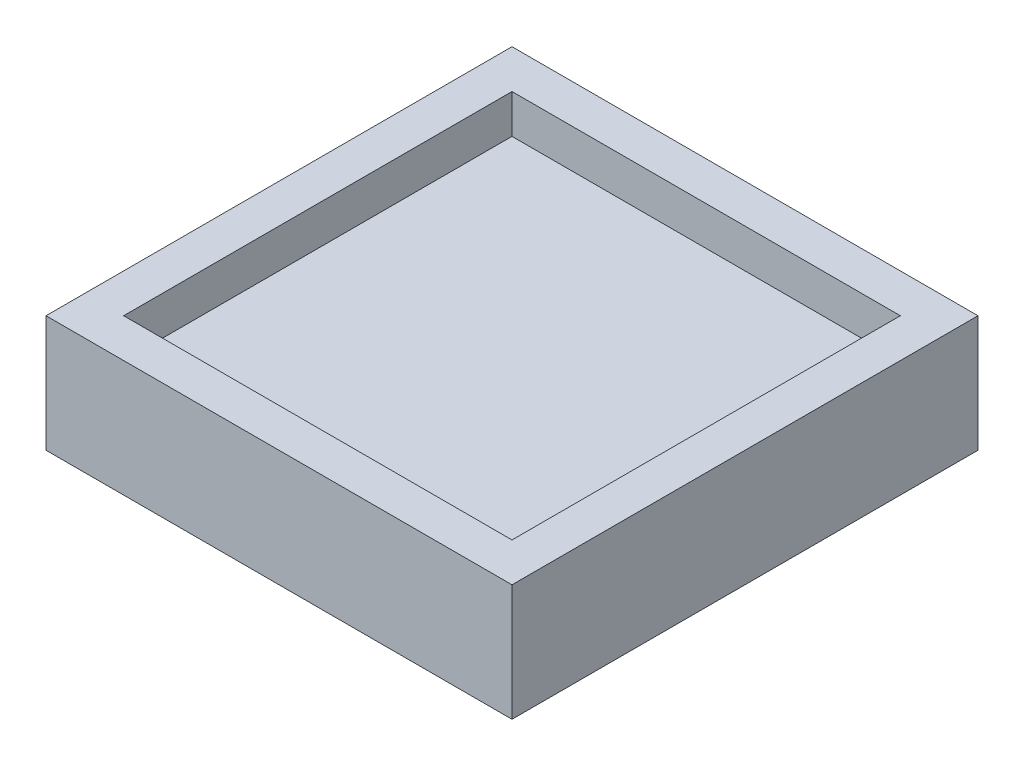
ISO-10303-21;
HEADER;
FILE_DESCRIPTION(('STEP AP214'),'2;1');
FILE_NAME('part.step','',(''),(''),'','','');
FILE_SCHEMA(('AUTOMOTIVE_DESIGN { 1 0 10303 214 1 1 1 1 }'));
ENDSEC;
DATA;
#1=APPLICATION_CONTEXT('core data for automotive mechanical design processes');
#2=APPLICATION_PROTOCOL_DEFINITION('international standard','automotive_design',2000,#1);
#3=PRODUCT_CONTEXT('',#1,'mechanical');
#4=PRODUCT('Part','Part','',(#3));
#5=PRODUCT_RELATED_PRODUCT_CATEGORY('part','',(#4));
#6=PRODUCT_DEFINITION_FORMATION('','',#4);
#7=PRODUCT_DEFINITION_CONTEXT('part definition',#1,'design');
#8=PRODUCT_DEFINITION('design','',#6,#7);
#9=PRODUCT_DEFINITION_SHAPE('','',#8);
#10=(LENGTH_UNIT() NAMED_UNIT(*) SI_UNIT(.MILLI.,.METRE.));
#11=(NAMED_UNIT(*) PLANE_ANGLE_UNIT() SI_UNIT($,.RADIAN.));
#12=(NAMED_UNIT(*) SI_UNIT($,.STERADIAN.) SOLID_ANGLE_UNIT());
#13=UNCERTAINTY_MEASURE_WITH_UNIT(LENGTH_MEASURE(1.E-05),#10,'distance_accuracy_value','');
#14=(GEOMETRIC_REPRESENTATION_CONTEXT(3) GLOBAL_UNCERTAINTY_ASSIGNED_CONTEXT((#13)) GLOBAL_UNIT_ASSIGNED_CONTEXT((#10,
#11,#12)) REPRESENTATION_CONTEXT('',''));
#15=CARTESIAN_POINT('',(0.,0.,0.));
#16=DIRECTION('',(0.,0.,1.));
#17=DIRECTION('',(1.,0.,0.));
#18=AXIS2_PLACEMENT_3D('',#15,#16,#17);
#19=CARTESIAN_POINT('',(0.,0.,12.));
#20=DIRECTION('',(1.,0.,0.));
#21=DIRECTION('',(0.,0.,-1.));
#22=AXIS2_PLACEMENT_3D('',#19,#20,#21);
#23=PLANE('',#22);
#24=DIRECTION('',(0.,-1.,0.));
#25=VECTOR('',#24,1.);
#26=CARTESIAN_POINT('',(0.,0.,0.));
#27=LINE('',#26,#25);
#28=CARTESIAN_POINT('',(0.,3.,0.));
#29=VERTEX_POINT('',#28);
#30=CARTESIAN_POINT('',(0.,0.,0.));
#31=VERTEX_POINT('',#30);
#32=EDGE_CURVE('E143',#29,#31,#27,.T.);
#33=ORIENTED_EDGE('',*,*,#32,.T.);
#34=DIRECTION('',(0.,0.,-1.));
#35=VECTOR('',#34,1.);
#36=CARTESIAN_POINT('',(0.,0.,12.));
#37=LINE('',#36,#35);
#38=CARTESIAN_POINT('',(0.,0.,12.));
#39=VERTEX_POINT('',#38);
#40=EDGE_CURVE('E11',#39,#31,#37,.T.);
#41=ORIENTED_EDGE('',*,*,#40,.F.);
#42=DIRECTION('',(0.,-1.,0.));
#43=VECTOR('',#42,1.);
#44=CARTESIAN_POINT('',(0.,0.,12.));
#45=LINE('',#44,#43);
#46=CARTESIAN_POINT('',(0.,3.,12.));
#47=VERTEX_POINT('',#46);
#48=EDGE_CURVE('E147',#47,#39,#45,.T.);
#49=ORIENTED_EDGE('',*,*,#48,.F.);
#50=DIRECTION('',(0.,0.,-1.));
#51=VECTOR('',#50,1.);
#52=CARTESIAN_POINT('',(0.,3.,12.));
#53=LINE('',#52,#51);
#54=EDGE_CURVE('E153',#47,#29,#53,.T.);
#55=ORIENTED_EDGE('',*,*,#54,.T.);
#56=EDGE_LOOP('',(#33,#41,#49,#55));
#57=FACE_BOUND('',#56,.T.);
#58=ADVANCED_FACE('F35',(#57),#23,.F.);
#59=CARTESIAN_POINT('',(0.,0.,12.));
#60=DIRECTION('',(0.,1.,0.));
#61=DIRECTION('',(0.,0.,1.));
#62=AXIS2_PLACEMENT_3D('',#59,#60,#61);
#63=PLANE('',#62);
#64=DIRECTION('',(1.,0.,0.));
#65=VECTOR('',#64,1.);
#66=CARTESIAN_POINT('',(0.,0.,0.));
#67=LINE('',#66,#65);
#68=CARTESIAN_POINT('',(12.,0.,0.));
#69=VERTEX_POINT('',#68);
#70=EDGE_CURVE('E156',#31,#69,#67,.T.);
#71=ORIENTED_EDGE('',*,*,#70,.T.);
#72=DIRECTION('',(0.,0.,-1.));
#73=VECTOR('',#72,1.);
#74=CARTESIAN_POINT('',(12.,0.,12.));
#75=LINE('',#74,#73);
#76=CARTESIAN_POINT('',(12.,0.,12.));
#77=VERTEX_POINT('',#76);
#78=EDGE_CURVE('E42',#77,#69,#75,.T.);
#79=ORIENTED_EDGE('',*,*,#78,.F.);
#80=DIRECTION('',(1.,0.,0.));
#81=VECTOR('',#80,1.);
#82=CARTESIAN_POINT('',(0.,0.,12.));
#83=LINE('',#82,#81);
#84=EDGE_CURVE('E86',#39,#77,#83,.T.);
#85=ORIENTED_EDGE('',*,*,#84,.F.);
#86=ORIENTED_EDGE('',*,*,#40,.T.);
#87=EDGE_LOOP('',(#71,#79,#85,#86));
#88=FACE_BOUND('',#87,.T.);
#89=ADVANCED_FACE('F185',(#88),#63,.F.);
#90=CARTESIAN_POINT('',(12.,0.,12.));
#91=DIRECTION('',(-1.,0.,0.));
#92=DIRECTION('',(0.,0.,1.));
#93=AXIS2_PLACEMENT_3D('',#90,#91,#92);
#94=PLANE('',#93);
#95=DIRECTION('',(0.,1.,0.));
#96=VECTOR('',#95,1.);
#97=CARTESIAN_POINT('',(12.,0.,0.));
#98=LINE('',#97,#96);
#99=CARTESIAN_POINT('',(12.,3.,0.));
#100=VERTEX_POINT('',#99);
#101=EDGE_CURVE('E158',#69,#100,#98,.T.);
#102=ORIENTED_EDGE('',*,*,#101,.T.);
#103=DIRECTION('',(0.,0.,-1.));
#104=VECTOR('',#103,1.);
#105=CARTESIAN_POINT('',(12.,3.,12.));
#106=LINE('',#105,#104);
#107=CARTESIAN_POINT('',(12.,3.,12.));
#108=VERTEX_POINT('',#107);
#109=EDGE_CURVE('E162',#108,#100,#106,.T.);
#110=ORIENTED_EDGE('',*,*,#109,.F.);
#111=DIRECTION('',(0.,1.,0.));
#112=VECTOR('',#111,1.);
#113=CARTESIAN_POINT('',(12.,0.,12.));
#114=LINE('',#113,#112);
#115=EDGE_CURVE('E150',#77,#108,#114,.T.);
#116=ORIENTED_EDGE('',*,*,#115,.F.);
#117=ORIENTED_EDGE('',*,*,#78,.T.);
#118=EDGE_LOOP('',(#102,#110,#116,#117));
#119=FACE_BOUND('',#118,.T.);
#120=ADVANCED_FACE('F167',(#119),#94,.F.);
#121=CARTESIAN_POINT('',(0.,3.,12.));
#122=DIRECTION('',(0.,-1.,0.));
#123=DIRECTION('',(0.,0.,-1.));
#124=AXIS2_PLACEMENT_3D('',#121,#122,#123);
#125=PLANE('',#124);
#126=DIRECTION('',(-1.,0.,0.));
#127=VECTOR('',#126,1.);
#128=CARTESIAN_POINT('',(0.999999999999997,3.,0.999999999999997));
#129=LINE('',#128,#127);
#130=CARTESIAN_POINT('',(11.,3.,0.999999999999999));
#131=VERTEX_POINT('',#130);
#132=CARTESIAN_POINT('',(0.999999999999997,3.,0.999999999999997));
#133=VERTEX_POINT('',#132);
#134=EDGE_CURVE('E137',#131,#133,#129,.T.);
#135=ORIENTED_EDGE('',*,*,#134,.F.);
#136=DIRECTION('',(0.,0.,-1.));
#137=VECTOR('',#136,1.);
#138=CARTESIAN_POINT('',(11.,3.,0.999999999999999));
#139=LINE('',#138,#137);
#140=CARTESIAN_POINT('',(11.,3.,11.));
#141=VERTEX_POINT('',#140);
#142=EDGE_CURVE('E49',#141,#131,#139,.T.);
#143=ORIENTED_EDGE('',*,*,#142,.F.);
#144=DIRECTION('',(1.,0.,0.));
#145=VECTOR('',#144,1.);
#146=CARTESIAN_POINT('',(0.999999999999998,3.,11.));
#147=LINE('',#146,#145);
#148=CARTESIAN_POINT('',(0.999999999999998,3.,11.));
#149=VERTEX_POINT('',#148);
#150=EDGE_CURVE('E128',#149,#141,#147,.T.);
#151=ORIENTED_EDGE('',*,*,#150,.F.);
#152=DIRECTION('',(0.,0.,1.));
#153=VECTOR('',#152,1.);
#154=CARTESIAN_POINT('',(0.999999999999997,3.,0.999999999999997));
#155=LINE('',#154,#153);
#156=EDGE_CURVE('E131',#133,#149,#155,.T.);
#157=ORIENTED_EDGE('',*,*,#156,.F.);
#158=EDGE_LOOP('',(#135,#143,#151,#157));
#159=FACE_BOUND('',#158,.T.);
#160=DIRECTION('',(-1.,0.,0.));
#161=VECTOR('',#160,1.);
#162=CARTESIAN_POINT('',(0.,3.,0.));
#163=LINE('',#162,#161);
#164=EDGE_CURVE('E79',#100,#29,#163,.T.);
#165=ORIENTED_EDGE('',*,*,#164,.T.);
#166=ORIENTED_EDGE('',*,*,#54,.F.);
#167=DIRECTION('',(-1.,0.,0.));
#168=VECTOR('',#167,1.);
#169=CARTESIAN_POINT('',(0.,3.,12.));
#170=LINE('',#169,#168);
#171=EDGE_CURVE('E58',#108,#47,#170,.T.);
#172=ORIENTED_EDGE('',*,*,#171,.F.);
#173=ORIENTED_EDGE('',*,*,#109,.T.);
#174=EDGE_LOOP('',(#165,#166,#172,#173));
#175=FACE_BOUND('',#174,.T.);
#176=ADVANCED_FACE('F175',(#159,#175),#125,.F.);
#177=CARTESIAN_POINT('',(0.,0.,12.));
#178=DIRECTION('',(0.,0.,-1.));
#179=DIRECTION('',(-1.,0.,0.));
#180=AXIS2_PLACEMENT_3D('',#177,#178,#179);
#181=PLANE('',#180);
#182=ORIENTED_EDGE('',*,*,#48,.T.);
#183=ORIENTED_EDGE('',*,*,#84,.T.);
#184=ORIENTED_EDGE('',*,*,#115,.T.);
#185=ORIENTED_EDGE('',*,*,#171,.T.);
#186=EDGE_LOOP('',(#182,#183,#184,#185));
#187=FACE_BOUND('',#186,.T.);
#188=ADVANCED_FACE('F177',(#187),#181,.F.);
#189=CARTESIAN_POINT('',(0.,0.,0.));
#190=DIRECTION('',(0.,0.,-1.));
#191=DIRECTION('',(-1.,0.,0.));
#192=AXIS2_PLACEMENT_3D('',#189,#190,#191);
#193=PLANE('',#192);
#194=ORIENTED_EDGE('',*,*,#32,.F.);
#195=ORIENTED_EDGE('',*,*,#164,.F.);
#196=ORIENTED_EDGE('',*,*,#101,.F.);
#197=ORIENTED_EDGE('',*,*,#70,.F.);
#198=EDGE_LOOP('',(#194,#195,#196,#197));
#199=FACE_BOUND('',#198,.T.);
#200=ADVANCED_FACE('F171',(#199),#193,.T.);
#201=CARTESIAN_POINT('',(11.,2.,0.999999999999999));
#202=DIRECTION('',(1.,0.,0.));
#203=DIRECTION('',(0.,0.,-1.));
#204=AXIS2_PLACEMENT_3D('',#201,#202,#203);
#205=PLANE('',#204);
#206=ORIENTED_EDGE('',*,*,#142,.T.);
#207=DIRECTION('',(0.,1.,0.));
#208=VECTOR('',#207,1.);
#209=CARTESIAN_POINT('',(11.,2.,0.999999999999999));
#210=LINE('',#209,#208);
#211=CARTESIAN_POINT('',(11.,2.,0.999999999999999));
#212=VERTEX_POINT('',#211);
#213=EDGE_CURVE('E106',#212,#131,#210,.T.);
#214=ORIENTED_EDGE('',*,*,#213,.F.);
#215=DIRECTION('',(0.,0.,-1.));
#216=VECTOR('',#215,1.);
#217=CARTESIAN_POINT('',(11.,2.,0.999999999999999));
#218=LINE('',#217,#216);
#219=CARTESIAN_POINT('',(11.,2.,11.));
#220=VERTEX_POINT('',#219);
#221=EDGE_CURVE('E110',#220,#212,#218,.T.);
#222=ORIENTED_EDGE('',*,*,#221,.F.);
#223=DIRECTION('',(0.,1.,0.));
#224=VECTOR('',#223,1.);
#225=CARTESIAN_POINT('',(11.,2.,11.));
#226=LINE('',#225,#224);
#227=EDGE_CURVE('E141',#220,#141,#226,.T.);
#228=ORIENTED_EDGE('',*,*,#227,.T.);
#229=EDGE_LOOP('',(#206,#214,#222,#228));
#230=FACE_BOUND('',#229,.T.);
#231=ADVANCED_FACE('F108',(#230),#205,.F.);
#232=CARTESIAN_POINT('',(0.999999999999998,2.,11.));
#233=DIRECTION('',(0.,0.,1.));
#234=DIRECTION('',(1.,0.,0.));
#235=AXIS2_PLACEMENT_3D('',#232,#233,#234);
#236=PLANE('',#235);
#237=ORIENTED_EDGE('',*,*,#150,.T.);
#238=ORIENTED_EDGE('',*,*,#227,.F.);
#239=DIRECTION('',(1.,0.,0.));
#240=VECTOR('',#239,1.);
#241=CARTESIAN_POINT('',(0.999999999999998,2.,11.));
#242=LINE('',#241,#240);
#243=CARTESIAN_POINT('',(0.999999999999998,2.,11.));
#244=VERTEX_POINT('',#243);
#245=EDGE_CURVE('E116',#244,#220,#242,.T.);
#246=ORIENTED_EDGE('',*,*,#245,.F.);
#247=DIRECTION('',(0.,1.,0.));
#248=VECTOR('',#247,1.);
#249=CARTESIAN_POINT('',(0.999999999999998,2.,11.));
#250=LINE('',#249,#248);
#251=EDGE_CURVE('E144',#244,#149,#250,.T.);
#252=ORIENTED_EDGE('',*,*,#251,.T.);
#253=EDGE_LOOP('',(#237,#238,#246,#252));
#254=FACE_BOUND('',#253,.T.);
#255=ADVANCED_FACE('F224',(#254),#236,.F.);
#256=CARTESIAN_POINT('',(0.999999999999997,2.,0.999999999999997));
#257=DIRECTION('',(-1.,0.,0.));
#258=DIRECTION('',(0.,0.,1.));
#259=AXIS2_PLACEMENT_3D('',#256,#257,#258);
#260=PLANE('',#259);
#261=ORIENTED_EDGE('',*,*,#156,.T.);
#262=ORIENTED_EDGE('',*,*,#251,.F.);
#263=DIRECTION('',(0.,0.,1.));
#264=VECTOR('',#263,1.);
#265=CARTESIAN_POINT('',(0.999999999999997,2.,0.999999999999997));
#266=LINE('',#265,#264);
#267=CARTESIAN_POINT('',(0.999999999999997,2.,0.999999999999997));
#268=VERTEX_POINT('',#267);
#269=EDGE_CURVE('E124',#268,#244,#266,.T.);
#270=ORIENTED_EDGE('',*,*,#269,.F.);
#271=DIRECTION('',(0.,1.,0.));
#272=VECTOR('',#271,1.);
#273=CARTESIAN_POINT('',(0.999999999999997,2.,0.999999999999997));
#274=LINE('',#273,#272);
#275=EDGE_CURVE('E115',#268,#133,#274,.T.);
#276=ORIENTED_EDGE('',*,*,#275,.T.);
#277=EDGE_LOOP('',(#261,#262,#270,#276));
#278=FACE_BOUND('',#277,.T.);
#279=ADVANCED_FACE('F233',(#278),#260,.F.);
#280=CARTESIAN_POINT('',(0.999999999999997,2.,0.999999999999997));
#281=DIRECTION('',(0.,0.,-1.));
#282=DIRECTION('',(-1.,0.,0.));
#283=AXIS2_PLACEMENT_3D('',#280,#281,#282);
#284=PLANE('',#283);
#285=ORIENTED_EDGE('',*,*,#134,.T.);
#286=ORIENTED_EDGE('',*,*,#275,.F.);
#287=DIRECTION('',(-1.,0.,0.));
#288=VECTOR('',#287,1.);
#289=CARTESIAN_POINT('',(0.999999999999997,2.,0.999999999999997));
#290=LINE('',#289,#288);
#291=EDGE_CURVE('E119',#212,#268,#290,.T.);
#292=ORIENTED_EDGE('',*,*,#291,.F.);
#293=ORIENTED_EDGE('',*,*,#213,.T.);
#294=EDGE_LOOP('',(#285,#286,#292,#293));
#295=FACE_BOUND('',#294,.T.);
#296=ADVANCED_FACE('F120',(#295),#284,.F.);
#297=CARTESIAN_POINT('',(0.,2.,0.));
#298=DIRECTION('',(0.,1.,0.));
#299=DIRECTION('',(0.,0.,1.));
#300=AXIS2_PLACEMENT_3D('',#297,#298,#299);
#301=PLANE('',#300);
#302=ORIENTED_EDGE('',*,*,#221,.T.);
#303=ORIENTED_EDGE('',*,*,#291,.T.);
#304=ORIENTED_EDGE('',*,*,#269,.T.);
#305=ORIENTED_EDGE('',*,*,#245,.T.);
#306=EDGE_LOOP('',(#302,#303,#304,#305));
#307=FACE_BOUND('',#306,.T.);
#308=ADVANCED_FACE('F126',(#307),#301,.T.);
#309=CLOSED_SHELL('',(#58,#89,#120,#176,#188,#200,#231,#255,#279,#296,#308));
#310=MANIFOLD_SOLID_BREP('B2',#309);
#311=ADVANCED_BREP_SHAPE_REPRESENTATION('',(#18,#310),#14);
#312=SHAPE_DEFINITION_REPRESENTATION(#9,#311);
ENDSEC;
END-ISO-10303-21;
